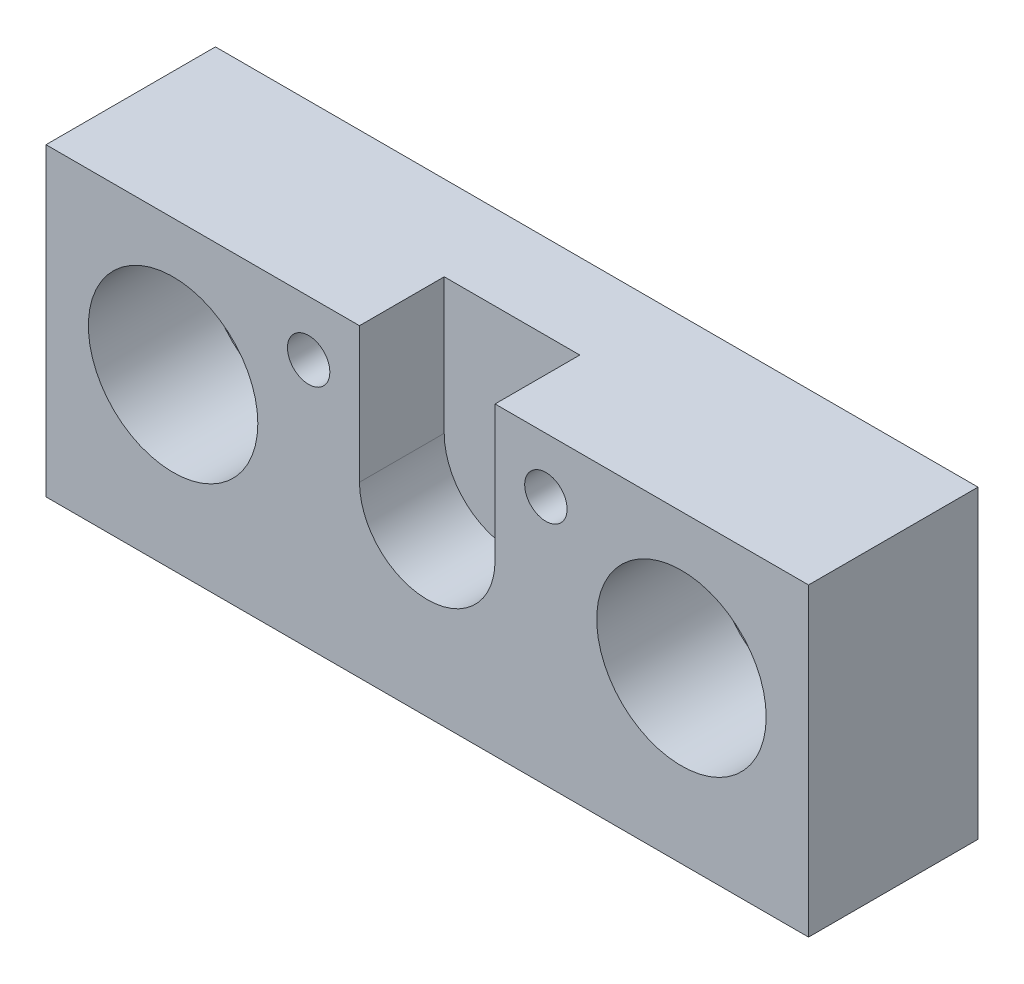
ISO-10303-21;
HEADER;
FILE_DESCRIPTION(('STEP AP214'),'2;1');
FILE_NAME('part.step','',(''),(''),'','','');
FILE_SCHEMA(('AUTOMOTIVE_DESIGN { 1 0 10303 214 1 1 1 1 }'));
ENDSEC;
DATA;
#1=APPLICATION_CONTEXT('core data for automotive mechanical design processes');
#2=APPLICATION_PROTOCOL_DEFINITION('international standard','automotive_design',2000,#1);
#3=PRODUCT_CONTEXT('',#1,'mechanical');
#4=PRODUCT('Part','Part','',(#3));
#5=PRODUCT_RELATED_PRODUCT_CATEGORY('part','',(#4));
#6=PRODUCT_DEFINITION_FORMATION('','',#4);
#7=PRODUCT_DEFINITION_CONTEXT('part definition',#1,'design');
#8=PRODUCT_DEFINITION('design','',#6,#7);
#9=PRODUCT_DEFINITION_SHAPE('','',#8);
#10=(LENGTH_UNIT() NAMED_UNIT(*) SI_UNIT(.MILLI.,.METRE.));
#11=(NAMED_UNIT(*) PLANE_ANGLE_UNIT() SI_UNIT($,.RADIAN.));
#12=(NAMED_UNIT(*) SI_UNIT($,.STERADIAN.) SOLID_ANGLE_UNIT());
#13=UNCERTAINTY_MEASURE_WITH_UNIT(LENGTH_MEASURE(1.E-05),#10,'distance_accuracy_value','');
#14=(GEOMETRIC_REPRESENTATION_CONTEXT(3) GLOBAL_UNCERTAINTY_ASSIGNED_CONTEXT((#13)) GLOBAL_UNIT_ASSIGNED_CONTEXT((#10,
#11,#12)) REPRESENTATION_CONTEXT('',''));
#15=CARTESIAN_POINT('',(0.,0.,0.));
#16=DIRECTION('',(0.,0.,1.));
#17=DIRECTION('',(1.,0.,0.));
#18=AXIS2_PLACEMENT_3D('',#15,#16,#17);
#19=CARTESIAN_POINT('',(22.5,9.,10.));
#20=DIRECTION('',(-1.,0.,0.));
#21=DIRECTION('',(0.,-1.,0.));
#22=AXIS2_PLACEMENT_3D('',#19,#20,#21);
#23=PLANE('',#22);
#24=DIRECTION('',(0.,1.,0.));
#25=VECTOR('',#24,1.);
#26=CARTESIAN_POINT('',(22.5,9.,0.));
#27=LINE('',#26,#25);
#28=CARTESIAN_POINT('',(22.5,-9.,0.));
#29=VERTEX_POINT('',#28);
#30=CARTESIAN_POINT('',(22.5,9.,0.));
#31=VERTEX_POINT('',#30);
#32=EDGE_CURVE('E143',#29,#31,#27,.T.);
#33=ORIENTED_EDGE('',*,*,#32,.T.);
#34=DIRECTION('',(0.,0.,-1.));
#35=VECTOR('',#34,1.);
#36=CARTESIAN_POINT('',(22.5,9.,10.));
#37=LINE('',#36,#35);
#38=CARTESIAN_POINT('',(22.5,9.,10.));
#39=VERTEX_POINT('',#38);
#40=EDGE_CURVE('E24',#39,#31,#37,.T.);
#41=ORIENTED_EDGE('',*,*,#40,.F.);
#42=DIRECTION('',(0.,1.,0.));
#43=VECTOR('',#42,1.);
#44=CARTESIAN_POINT('',(22.5,9.,10.));
#45=LINE('',#44,#43);
#46=CARTESIAN_POINT('',(22.5,-9.,10.));
#47=VERTEX_POINT('',#46);
#48=EDGE_CURVE('E152',#47,#39,#45,.T.);
#49=ORIENTED_EDGE('',*,*,#48,.F.);
#50=DIRECTION('',(0.,0.,-1.));
#51=VECTOR('',#50,1.);
#52=CARTESIAN_POINT('',(22.5,-9.,10.));
#53=LINE('',#52,#51);
#54=EDGE_CURVE('E159',#47,#29,#53,.T.);
#55=ORIENTED_EDGE('',*,*,#54,.T.);
#56=EDGE_LOOP('',(#33,#41,#49,#55));
#57=FACE_BOUND('',#56,.T.);
#58=ADVANCED_FACE('F17',(#57),#23,.F.);
#59=CARTESIAN_POINT('',(-22.5,9.,10.));
#60=DIRECTION('',(0.,-1.,0.));
#61=DIRECTION('',(0.,0.,-1.));
#62=AXIS2_PLACEMENT_3D('',#59,#60,#61);
#63=PLANE('',#62);
#64=DIRECTION('',(-1.,0.,0.));
#65=VECTOR('',#64,1.);
#66=CARTESIAN_POINT('',(-22.5,9.,10.));
#67=LINE('',#66,#65);
#68=CARTESIAN_POINT('',(-4.,9.,10.));
#69=VERTEX_POINT('',#68);
#70=CARTESIAN_POINT('',(-22.5,9.,10.));
#71=VERTEX_POINT('',#70);
#72=EDGE_CURVE('E154',#69,#71,#67,.T.);
#73=ORIENTED_EDGE('',*,*,#72,.F.);
#74=DIRECTION('',(0.,0.,1.));
#75=VECTOR('',#74,1.);
#76=CARTESIAN_POINT('',(-4.,9.,5.));
#77=LINE('',#76,#75);
#78=CARTESIAN_POINT('',(-4.,9.,5.));
#79=VERTEX_POINT('',#78);
#80=EDGE_CURVE('E135',#79,#69,#77,.T.);
#81=ORIENTED_EDGE('',*,*,#80,.F.);
#82=DIRECTION('',(-1.,0.,0.));
#83=VECTOR('',#82,1.);
#84=CARTESIAN_POINT('',(-22.5,9.,5.));
#85=LINE('',#84,#83);
#86=CARTESIAN_POINT('',(4.,9.,5.));
#87=VERTEX_POINT('',#86);
#88=EDGE_CURVE('E11',#87,#79,#85,.T.);
#89=ORIENTED_EDGE('',*,*,#88,.F.);
#90=DIRECTION('',(0.,0.,1.));
#91=VECTOR('',#90,1.);
#92=CARTESIAN_POINT('',(4.,9.,5.));
#93=LINE('',#92,#91);
#94=CARTESIAN_POINT('',(4.,9.,10.));
#95=VERTEX_POINT('',#94);
#96=EDGE_CURVE('E137',#87,#95,#93,.T.);
#97=ORIENTED_EDGE('',*,*,#96,.T.);
#98=EDGE_CURVE('E69',#39,#95,#67,.T.);
#99=ORIENTED_EDGE('',*,*,#98,.F.);
#100=ORIENTED_EDGE('',*,*,#40,.T.);
#101=DIRECTION('',(-1.,0.,0.));
#102=VECTOR('',#101,1.);
#103=CARTESIAN_POINT('',(-22.5,9.,0.));
#104=LINE('',#103,#102);
#105=CARTESIAN_POINT('',(-22.5,9.,0.));
#106=VERTEX_POINT('',#105);
#107=EDGE_CURVE('E162',#31,#106,#104,.T.);
#108=ORIENTED_EDGE('',*,*,#107,.T.);
#109=DIRECTION('',(0.,0.,-1.));
#110=VECTOR('',#109,1.);
#111=CARTESIAN_POINT('',(-22.5,9.,10.));
#112=LINE('',#111,#110);
#113=EDGE_CURVE('E170',#71,#106,#112,.T.);
#114=ORIENTED_EDGE('',*,*,#113,.F.);
#115=EDGE_LOOP('',(#73,#81,#89,#97,#99,#100,#108,#114));
#116=FACE_BOUND('',#115,.T.);
#117=ADVANCED_FACE('F174',(#116),#63,.F.);
#118=CARTESIAN_POINT('',(-22.5,9.,10.));
#119=DIRECTION('',(1.,0.,0.));
#120=DIRECTION('',(0.,0.,-1.));
#121=AXIS2_PLACEMENT_3D('',#118,#119,#120);
#122=PLANE('',#121);
#123=DIRECTION('',(0.,-1.,0.));
#124=VECTOR('',#123,1.);
#125=CARTESIAN_POINT('',(-22.5,9.,0.));
#126=LINE('',#125,#124);
#127=CARTESIAN_POINT('',(-22.5,-9.,0.));
#128=VERTEX_POINT('',#127);
#129=EDGE_CURVE('E164',#106,#128,#126,.T.);
#130=ORIENTED_EDGE('',*,*,#129,.T.);
#131=DIRECTION('',(0.,0.,-1.));
#132=VECTOR('',#131,1.);
#133=CARTESIAN_POINT('',(-22.5,-9.,10.));
#134=LINE('',#133,#132);
#135=CARTESIAN_POINT('',(-22.5,-9.,10.));
#136=VERTEX_POINT('',#135);
#137=EDGE_CURVE('E168',#136,#128,#134,.T.);
#138=ORIENTED_EDGE('',*,*,#137,.F.);
#139=DIRECTION('',(0.,-1.,0.));
#140=VECTOR('',#139,1.);
#141=CARTESIAN_POINT('',(-22.5,9.,10.));
#142=LINE('',#141,#140);
#143=EDGE_CURVE('E156',#71,#136,#142,.T.);
#144=ORIENTED_EDGE('',*,*,#143,.F.);
#145=ORIENTED_EDGE('',*,*,#113,.T.);
#146=EDGE_LOOP('',(#130,#138,#144,#145));
#147=FACE_BOUND('',#146,.T.);
#148=ADVANCED_FACE('F184',(#147),#122,.F.);
#149=CARTESIAN_POINT('',(-22.5,-9.,10.));
#150=DIRECTION('',(0.,1.,0.));
#151=DIRECTION('',(0.,0.,1.));
#152=AXIS2_PLACEMENT_3D('',#149,#150,#151);
#153=PLANE('',#152);
#154=DIRECTION('',(1.,0.,0.));
#155=VECTOR('',#154,1.);
#156=CARTESIAN_POINT('',(-22.5,-9.,0.));
#157=LINE('',#156,#155);
#158=EDGE_CURVE('E61',#128,#29,#157,.T.);
#159=ORIENTED_EDGE('',*,*,#158,.T.);
#160=ORIENTED_EDGE('',*,*,#54,.F.);
#161=DIRECTION('',(1.,0.,0.));
#162=VECTOR('',#161,1.);
#163=CARTESIAN_POINT('',(-22.5,-9.,10.));
#164=LINE('',#163,#162);
#165=EDGE_CURVE('E40',#136,#47,#164,.T.);
#166=ORIENTED_EDGE('',*,*,#165,.F.);
#167=ORIENTED_EDGE('',*,*,#137,.T.);
#168=EDGE_LOOP('',(#159,#160,#166,#167));
#169=FACE_BOUND('',#168,.T.);
#170=ADVANCED_FACE('F186',(#169),#153,.F.);
#171=CARTESIAN_POINT('',(0.,0.,10.));
#172=DIRECTION('',(0.,0.,1.));
#173=DIRECTION('',(1.,0.,0.));
#174=AXIS2_PLACEMENT_3D('',#171,#172,#173);
#175=PLANE('',#174);
#176=CARTESIAN_POINT('',(-7.,5.75,10.));
#177=DIRECTION('',(0.,0.,1.));
#178=DIRECTION('',(1.,0.,0.));
#179=AXIS2_PLACEMENT_3D('',#176,#177,#178);
#180=CIRCLE('',#179,1.25);
#181=CARTESIAN_POINT('',(-5.75,5.75,10.));
#182=VERTEX_POINT('',#181);
#183=EDGE_CURVE('E106',#182,#182,#180,.T.);
#184=ORIENTED_EDGE('',*,*,#183,.F.);
#185=EDGE_LOOP('',(#184));
#186=FACE_BOUND('',#185,.T.);
#187=CARTESIAN_POINT('',(7.,5.75,10.));
#188=DIRECTION('',(0.,0.,1.));
#189=DIRECTION('',(1.,0.,0.));
#190=AXIS2_PLACEMENT_3D('',#187,#188,#189);
#191=CIRCLE('',#190,1.25);
#192=CARTESIAN_POINT('',(8.25,5.75,10.));
#193=VERTEX_POINT('',#192);
#194=EDGE_CURVE('E105',#193,#193,#191,.T.);
#195=ORIENTED_EDGE('',*,*,#194,.F.);
#196=EDGE_LOOP('',(#195));
#197=FACE_BOUND('',#196,.T.);
#198=DIRECTION('',(0.,-1.,0.));
#199=VECTOR('',#198,1.);
#200=CARTESIAN_POINT('',(-4.,1.,10.));
#201=LINE('',#200,#199);
#202=CARTESIAN_POINT('',(-4.,1.,10.));
#203=VERTEX_POINT('',#202);
#204=EDGE_CURVE('E120',#69,#203,#201,.T.);
#205=ORIENTED_EDGE('',*,*,#204,.F.);
#206=ORIENTED_EDGE('',*,*,#72,.T.);
#207=ORIENTED_EDGE('',*,*,#143,.T.);
#208=ORIENTED_EDGE('',*,*,#165,.T.);
#209=ORIENTED_EDGE('',*,*,#48,.T.);
#210=ORIENTED_EDGE('',*,*,#98,.T.);
#211=DIRECTION('',(0.,1.,0.));
#212=VECTOR('',#211,1.);
#213=CARTESIAN_POINT('',(4.,1.,10.));
#214=LINE('',#213,#212);
#215=CARTESIAN_POINT('',(4.,1.,10.));
#216=VERTEX_POINT('',#215);
#217=EDGE_CURVE('E128',#216,#95,#214,.T.);
#218=ORIENTED_EDGE('',*,*,#217,.F.);
#219=CARTESIAN_POINT('',(0.,1.,10.));
#220=DIRECTION('',(0.,0.,1.));
#221=DIRECTION('',(1.,0.,0.));
#222=AXIS2_PLACEMENT_3D('',#219,#220,#221);
#223=CIRCLE('',#222,4.);
#224=EDGE_CURVE('E31',#203,#216,#223,.T.);
#225=ORIENTED_EDGE('',*,*,#224,.F.);
#226=EDGE_LOOP('',(#205,#206,#207,#208,#209,#210,#218,#225));
#227=FACE_BOUND('',#226,.T.);
#228=CARTESIAN_POINT('',(15.,1.,10.));
#229=DIRECTION('',(0.,0.,1.));
#230=DIRECTION('',(1.,0.,0.));
#231=AXIS2_PLACEMENT_3D('',#228,#229,#230);
#232=CIRCLE('',#231,5.);
#233=CARTESIAN_POINT('',(20.,1.,10.));
#234=VERTEX_POINT('',#233);
#235=EDGE_CURVE('E144',#234,#234,#232,.T.);
#236=ORIENTED_EDGE('',*,*,#235,.F.);
#237=EDGE_LOOP('',(#236));
#238=FACE_BOUND('',#237,.T.);
#239=CARTESIAN_POINT('',(-15.,1.,10.));
#240=DIRECTION('',(0.,0.,1.));
#241=DIRECTION('',(1.,0.,0.));
#242=AXIS2_PLACEMENT_3D('',#239,#240,#241);
#243=CIRCLE('',#242,5.);
#244=CARTESIAN_POINT('',(-10.,1.,10.));
#245=VERTEX_POINT('',#244);
#246=EDGE_CURVE('E134',#245,#245,#243,.T.);
#247=ORIENTED_EDGE('',*,*,#246,.F.);
#248=EDGE_LOOP('',(#247));
#249=FACE_BOUND('',#248,.T.);
#250=ADVANCED_FACE('F188',(#186,#197,#227,#238,#249),#175,.T.);
#251=CARTESIAN_POINT('',(0.,0.,0.));
#252=DIRECTION('',(0.,0.,1.));
#253=DIRECTION('',(1.,0.,0.));
#254=AXIS2_PLACEMENT_3D('',#251,#252,#253);
#255=PLANE('',#254);
#256=ORIENTED_EDGE('',*,*,#32,.F.);
#257=ORIENTED_EDGE('',*,*,#158,.F.);
#258=ORIENTED_EDGE('',*,*,#129,.F.);
#259=ORIENTED_EDGE('',*,*,#107,.F.);
#260=EDGE_LOOP('',(#256,#257,#258,#259));
#261=FACE_BOUND('',#260,.T.);
#262=ADVANCED_FACE('F180',(#261),#255,.F.);
#263=CARTESIAN_POINT('',(-15.,1.,3.));
#264=DIRECTION('',(0.,0.,1.));
#265=DIRECTION('',(1.,0.,0.));
#266=AXIS2_PLACEMENT_3D('',#263,#264,#265);
#267=CYLINDRICAL_SURFACE('',#266,5.);
#268=CARTESIAN_POINT('',(-15.,1.,3.));
#269=DIRECTION('',(0.,0.,1.));
#270=DIRECTION('',(1.,0.,0.));
#271=AXIS2_PLACEMENT_3D('',#268,#269,#270);
#272=CIRCLE('',#271,5.);
#273=CARTESIAN_POINT('',(-10.,1.,3.));
#274=VERTEX_POINT('',#273);
#275=EDGE_CURVE('E147',#274,#274,#272,.T.);
#276=ORIENTED_EDGE('',*,*,#275,.F.);
#277=EDGE_LOOP('',(#276));
#278=FACE_BOUND('',#277,.T.);
#279=ORIENTED_EDGE('',*,*,#246,.T.);
#280=EDGE_LOOP('',(#279));
#281=FACE_BOUND('',#280,.T.);
#282=ADVANCED_FACE('F231',(#278,#281),#267,.F.);
#283=CARTESIAN_POINT('',(-15.,1.,3.));
#284=DIRECTION('',(0.,0.,1.));
#285=DIRECTION('',(1.,0.,0.));
#286=AXIS2_PLACEMENT_3D('',#283,#284,#285);
#287=PLANE('',#286);
#288=ORIENTED_EDGE('',*,*,#275,.T.);
#289=EDGE_LOOP('',(#288));
#290=FACE_BOUND('',#289,.T.);
#291=ADVANCED_FACE('F237',(#290),#287,.T.);
#292=CARTESIAN_POINT('',(15.,1.,3.));
#293=DIRECTION('',(0.,0.,1.));
#294=DIRECTION('',(1.,0.,0.));
#295=AXIS2_PLACEMENT_3D('',#292,#293,#294);
#296=CYLINDRICAL_SURFACE('',#295,5.);
#297=CARTESIAN_POINT('',(15.,1.,3.));
#298=DIRECTION('',(0.,0.,1.));
#299=DIRECTION('',(1.,0.,0.));
#300=AXIS2_PLACEMENT_3D('',#297,#298,#299);
#301=CIRCLE('',#300,5.);
#302=CARTESIAN_POINT('',(20.,1.,3.));
#303=VERTEX_POINT('',#302);
#304=EDGE_CURVE('E140',#303,#303,#301,.T.);
#305=ORIENTED_EDGE('',*,*,#304,.F.);
#306=EDGE_LOOP('',(#305));
#307=FACE_BOUND('',#306,.T.);
#308=ORIENTED_EDGE('',*,*,#235,.T.);
#309=EDGE_LOOP('',(#308));
#310=FACE_BOUND('',#309,.T.);
#311=ADVANCED_FACE('F241',(#307,#310),#296,.F.);
#312=CARTESIAN_POINT('',(15.,1.,3.));
#313=DIRECTION('',(0.,0.,1.));
#314=DIRECTION('',(1.,0.,0.));
#315=AXIS2_PLACEMENT_3D('',#312,#313,#314);
#316=PLANE('',#315);
#317=ORIENTED_EDGE('',*,*,#304,.T.);
#318=EDGE_LOOP('',(#317));
#319=FACE_BOUND('',#318,.T.);
#320=ADVANCED_FACE('F212',(#319),#316,.T.);
#321=CARTESIAN_POINT('',(0.,1.,5.));
#322=DIRECTION('',(0.,0.,1.));
#323=DIRECTION('',(1.,0.,0.));
#324=AXIS2_PLACEMENT_3D('',#321,#322,#323);
#325=PLANE('',#324);
#326=ORIENTED_EDGE('',*,*,#88,.T.);
#327=DIRECTION('',(0.,-1.,0.));
#328=VECTOR('',#327,1.);
#329=CARTESIAN_POINT('',(-4.,1.,5.));
#330=LINE('',#329,#328);
#331=CARTESIAN_POINT('',(-4.,1.,5.));
#332=VERTEX_POINT('',#331);
#333=EDGE_CURVE('E123',#79,#332,#330,.T.);
#334=ORIENTED_EDGE('',*,*,#333,.T.);
#335=CARTESIAN_POINT('',(0.,1.,5.));
#336=DIRECTION('',(0.,0.,1.));
#337=DIRECTION('',(1.,0.,0.));
#338=AXIS2_PLACEMENT_3D('',#335,#336,#337);
#339=CIRCLE('',#338,4.);
#340=CARTESIAN_POINT('',(4.,1.,5.));
#341=VERTEX_POINT('',#340);
#342=EDGE_CURVE('E116',#332,#341,#339,.T.);
#343=ORIENTED_EDGE('',*,*,#342,.T.);
#344=DIRECTION('',(0.,1.,0.));
#345=VECTOR('',#344,1.);
#346=CARTESIAN_POINT('',(4.,1.,5.));
#347=LINE('',#346,#345);
#348=EDGE_CURVE('E119',#341,#87,#347,.T.);
#349=ORIENTED_EDGE('',*,*,#348,.T.);
#350=EDGE_LOOP('',(#326,#334,#343,#349));
#351=FACE_BOUND('',#350,.T.);
#352=ADVANCED_FACE('F198',(#351),#325,.T.);
#353=CARTESIAN_POINT('',(0.,1.,5.));
#354=DIRECTION('',(0.,0.,1.));
#355=DIRECTION('',(1.,0.,0.));
#356=AXIS2_PLACEMENT_3D('',#353,#354,#355);
#357=CYLINDRICAL_SURFACE('',#356,4.);
#358=ORIENTED_EDGE('',*,*,#224,.T.);
#359=DIRECTION('',(0.,0.,1.));
#360=VECTOR('',#359,1.);
#361=CARTESIAN_POINT('',(4.,1.,5.));
#362=LINE('',#361,#360);
#363=EDGE_CURVE('E126',#341,#216,#362,.T.);
#364=ORIENTED_EDGE('',*,*,#363,.F.);
#365=ORIENTED_EDGE('',*,*,#342,.F.);
#366=DIRECTION('',(0.,0.,1.));
#367=VECTOR('',#366,1.);
#368=CARTESIAN_POINT('',(-4.,1.,5.));
#369=LINE('',#368,#367);
#370=EDGE_CURVE('E132',#332,#203,#369,.T.);
#371=ORIENTED_EDGE('',*,*,#370,.T.);
#372=EDGE_LOOP('',(#358,#364,#365,#371));
#373=FACE_BOUND('',#372,.T.);
#374=ADVANCED_FACE('F202',(#373),#357,.F.);
#375=CARTESIAN_POINT('',(-4.,1.,5.));
#376=DIRECTION('',(-1.,0.,0.));
#377=DIRECTION('',(0.,0.,1.));
#378=AXIS2_PLACEMENT_3D('',#375,#376,#377);
#379=PLANE('',#378);
#380=ORIENTED_EDGE('',*,*,#204,.T.);
#381=ORIENTED_EDGE('',*,*,#370,.F.);
#382=ORIENTED_EDGE('',*,*,#333,.F.);
#383=ORIENTED_EDGE('',*,*,#80,.T.);
#384=EDGE_LOOP('',(#380,#381,#382,#383));
#385=FACE_BOUND('',#384,.T.);
#386=ADVANCED_FACE('F200',(#385),#379,.F.);
#387=CARTESIAN_POINT('',(4.,1.,5.));
#388=DIRECTION('',(1.,0.,0.));
#389=DIRECTION('',(0.,0.,-1.));
#390=AXIS2_PLACEMENT_3D('',#387,#388,#389);
#391=PLANE('',#390);
#392=ORIENTED_EDGE('',*,*,#217,.T.);
#393=ORIENTED_EDGE('',*,*,#96,.F.);
#394=ORIENTED_EDGE('',*,*,#348,.F.);
#395=ORIENTED_EDGE('',*,*,#363,.T.);
#396=EDGE_LOOP('',(#392,#393,#394,#395));
#397=FACE_BOUND('',#396,.T.);
#398=ADVANCED_FACE('F192',(#397),#391,.F.);
#399=CARTESIAN_POINT('',(7.,5.75,1.75107577378445));
#400=DIRECTION('',(0.,0.,1.));
#401=DIRECTION('',(1.,0.,0.));
#402=AXIS2_PLACEMENT_3D('',#399,#400,#401);
#403=CONICAL_SURFACE('',#402,1.25,1.02974425867665);
#404=CARTESIAN_POINT('',(7.,5.75,1.));
#405=VERTEX_POINT('',#404);
#406=VERTEX_LOOP('',#405);
#407=FACE_BOUND('',#406,.T.);
#408=CARTESIAN_POINT('',(7.,5.75,1.75107577378445));
#409=DIRECTION('',(0.,0.,1.));
#410=DIRECTION('',(1.,0.,0.));
#411=AXIS2_PLACEMENT_3D('',#408,#409,#410);
#412=CIRCLE('',#411,1.25);
#413=CARTESIAN_POINT('',(8.25,5.75,1.75107577378445));
#414=VERTEX_POINT('',#413);
#415=EDGE_CURVE('E109',#414,#414,#412,.T.);
#416=ORIENTED_EDGE('',*,*,#415,.T.);
#417=EDGE_LOOP('',(#416));
#418=FACE_BOUND('',#417,.T.);
#419=ADVANCED_FACE('F288',(#407,#418),#403,.F.);
#420=CARTESIAN_POINT('',(7.,5.75,10.));
#421=DIRECTION('',(0.,0.,1.));
#422=DIRECTION('',(1.,0.,0.));
#423=AXIS2_PLACEMENT_3D('',#420,#421,#422);
#424=CYLINDRICAL_SURFACE('',#423,1.25);
#425=ORIENTED_EDGE('',*,*,#415,.F.);
#426=EDGE_LOOP('',(#425));
#427=FACE_BOUND('',#426,.T.);
#428=ORIENTED_EDGE('',*,*,#194,.T.);
#429=EDGE_LOOP('',(#428));
#430=FACE_BOUND('',#429,.T.);
#431=ADVANCED_FACE('F99',(#427,#430),#424,.F.);
#432=CARTESIAN_POINT('',(-7.,5.75,1.75107577378445));
#433=DIRECTION('',(0.,0.,1.));
#434=DIRECTION('',(1.,0.,0.));
#435=AXIS2_PLACEMENT_3D('',#432,#433,#434);
#436=CONICAL_SURFACE('',#435,1.25,1.02974425867665);
#437=CARTESIAN_POINT('',(-7.,5.75,1.));
#438=VERTEX_POINT('',#437);
#439=VERTEX_LOOP('',#438);
#440=FACE_BOUND('',#439,.T.);
#441=CARTESIAN_POINT('',(-7.,5.75,1.75107577378445));
#442=DIRECTION('',(0.,0.,1.));
#443=DIRECTION('',(1.,0.,0.));
#444=AXIS2_PLACEMENT_3D('',#441,#442,#443);
#445=CIRCLE('',#444,1.25);
#446=CARTESIAN_POINT('',(-5.75,5.75,1.75107577378445));
#447=VERTEX_POINT('',#446);
#448=EDGE_CURVE('E103',#447,#447,#445,.T.);
#449=ORIENTED_EDGE('',*,*,#448,.T.);
#450=EDGE_LOOP('',(#449));
#451=FACE_BOUND('',#450,.T.);
#452=ADVANCED_FACE('F95',(#440,#451),#436,.F.);
#453=CARTESIAN_POINT('',(-7.,5.75,10.));
#454=DIRECTION('',(0.,0.,1.));
#455=DIRECTION('',(1.,0.,0.));
#456=AXIS2_PLACEMENT_3D('',#453,#454,#455);
#457=CYLINDRICAL_SURFACE('',#456,1.25);
#458=ORIENTED_EDGE('',*,*,#448,.F.);
#459=EDGE_LOOP('',(#458));
#460=FACE_BOUND('',#459,.T.);
#461=ORIENTED_EDGE('',*,*,#183,.T.);
#462=EDGE_LOOP('',(#461));
#463=FACE_BOUND('',#462,.T.);
#464=ADVANCED_FACE('F98',(#460,#463),#457,.F.);
#465=CLOSED_SHELL('',(#58,#117,#148,#170,#250,#262,#282,#291,#311,#320,#352,#374,#386,#398,#419,
#431,#452,#464));
#466=MANIFOLD_SOLID_BREP('B1',#465);
#467=ADVANCED_BREP_SHAPE_REPRESENTATION('',(#18,#466),#14);
#468=SHAPE_DEFINITION_REPRESENTATION(#9,#467);
ENDSEC;
END-ISO-10303-21;
